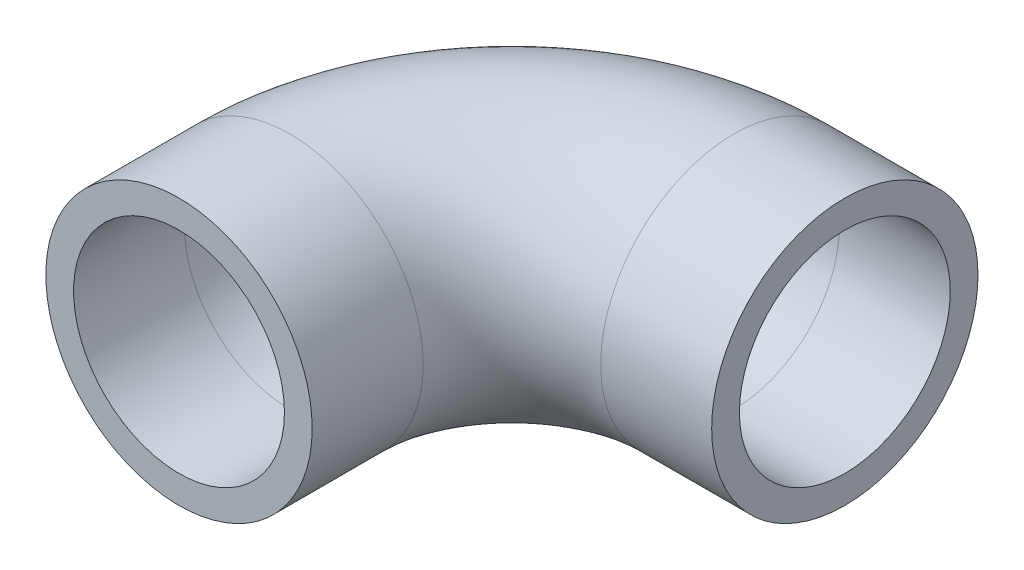
ISO-10303-21;
HEADER;
FILE_DESCRIPTION(('STEP AP214'),'2;1');
FILE_NAME('part.step','',(''),(''),'','','');
FILE_SCHEMA(('AUTOMOTIVE_DESIGN { 1 0 10303 214 1 1 1 1 }'));
ENDSEC;
DATA;
#1=APPLICATION_CONTEXT('core data for automotive mechanical design processes');
#2=APPLICATION_PROTOCOL_DEFINITION('international standard','automotive_design',2000,#1);
#3=PRODUCT_CONTEXT('',#1,'mechanical');
#4=PRODUCT('Part','Part','',(#3));
#5=PRODUCT_RELATED_PRODUCT_CATEGORY('part','',(#4));
#6=PRODUCT_DEFINITION_FORMATION('','',#4);
#7=PRODUCT_DEFINITION_CONTEXT('part definition',#1,'design');
#8=PRODUCT_DEFINITION('design','',#6,#7);
#9=PRODUCT_DEFINITION_SHAPE('','',#8);
#10=(LENGTH_UNIT() NAMED_UNIT(*) SI_UNIT(.MILLI.,.METRE.));
#11=(NAMED_UNIT(*) PLANE_ANGLE_UNIT() SI_UNIT($,.RADIAN.));
#12=(NAMED_UNIT(*) SI_UNIT($,.STERADIAN.) SOLID_ANGLE_UNIT());
#13=UNCERTAINTY_MEASURE_WITH_UNIT(LENGTH_MEASURE(1.E-05),#10,'distance_accuracy_value','');
#14=(GEOMETRIC_REPRESENTATION_CONTEXT(3) GLOBAL_UNCERTAINTY_ASSIGNED_CONTEXT((#13)) GLOBAL_UNIT_ASSIGNED_CONTEXT((#10,
#11,#12)) REPRESENTATION_CONTEXT('',''));
#15=CARTESIAN_POINT('',(0.,0.,0.));
#16=DIRECTION('',(0.,0.,1.));
#17=DIRECTION('',(1.,0.,0.));
#18=AXIS2_PLACEMENT_3D('',#15,#16,#17);
#19=CARTESIAN_POINT('',(50.8000000000002,0.,-76.1999999999998));
#20=DIRECTION('',(1.,0.,0.));
#21=DIRECTION('',(0.,0.,-1.));
#22=AXIS2_PLACEMENT_3D('',#19,#20,#21);
#23=CYLINDRICAL_SURFACE('',#22,30.48);
#24=CARTESIAN_POINT('',(50.8000000000002,0.,-76.1999999999998));
#25=DIRECTION('',(-1.,0.,0.));
#26=DIRECTION('',(0.,0.,1.));
#27=AXIS2_PLACEMENT_3D('',#24,#25,#26);
#28=CIRCLE('',#27,30.48);
#29=CARTESIAN_POINT('',(50.8000000000003,0.,-106.68));
#30=VERTEX_POINT('',#29);
#31=EDGE_CURVE('E47',#30,#30,#28,.T.);
#32=ORIENTED_EDGE('',*,*,#31,.F.);
#33=EDGE_LOOP('',(#32));
#34=FACE_BOUND('',#33,.T.);
#35=CARTESIAN_POINT('',(76.2,0.,-76.1999999999997));
#36=DIRECTION('',(-1.,0.,0.));
#37=DIRECTION('',(0.,0.,1.));
#38=AXIS2_PLACEMENT_3D('',#35,#36,#37);
#39=CIRCLE('',#38,30.48);
#40=CARTESIAN_POINT('',(76.1999999999999,0.,-45.7199999999997));
#41=VERTEX_POINT('',#40);
#42=EDGE_CURVE('E10',#41,#41,#39,.T.);
#43=ORIENTED_EDGE('',*,*,#42,.T.);
#44=EDGE_LOOP('',(#43));
#45=FACE_BOUND('',#44,.T.);
#46=ADVANCED_FACE('F35',(#34,#45),#23,.T.);
#47=CARTESIAN_POINT('',(50.8000000000002,0.,-76.1999999999998));
#48=DIRECTION('',(1.,0.,0.));
#49=DIRECTION('',(0.,0.,-1.));
#50=AXIS2_PLACEMENT_3D('',#47,#48,#49);
#51=CYLINDRICAL_SURFACE('',#50,24.13);
#52=CARTESIAN_POINT('',(50.8000000000002,0.,-76.1999999999998));
#53=DIRECTION('',(-1.,0.,0.));
#54=DIRECTION('',(0.,0.,1.));
#55=AXIS2_PLACEMENT_3D('',#52,#53,#54);
#56=CIRCLE('',#55,24.13);
#57=CARTESIAN_POINT('',(50.8000000000003,0.,-100.33));
#58=VERTEX_POINT('',#57);
#59=EDGE_CURVE('E53',#58,#58,#56,.T.);
#60=ORIENTED_EDGE('',*,*,#59,.T.);
#61=EDGE_LOOP('',(#60));
#62=FACE_BOUND('',#61,.T.);
#63=CARTESIAN_POINT('',(76.2,0.,-76.1999999999997));
#64=DIRECTION('',(-1.,0.,0.));
#65=DIRECTION('',(0.,0.,1.));
#66=AXIS2_PLACEMENT_3D('',#63,#64,#65);
#67=CIRCLE('',#66,24.13);
#68=CARTESIAN_POINT('',(76.1999999999999,0.,-52.0699999999997));
#69=VERTEX_POINT('',#68);
#70=EDGE_CURVE('E42',#69,#69,#67,.T.);
#71=ORIENTED_EDGE('',*,*,#70,.F.);
#72=EDGE_LOOP('',(#71));
#73=FACE_BOUND('',#72,.T.);
#74=ADVANCED_FACE('F100',(#62,#73),#51,.F.);
#75=CARTESIAN_POINT('',(50.8,0.,-25.3999999999998));
#76=DIRECTION('',(0.,-1.,0.));
#77=DIRECTION('',(0.,0.,-1.));
#78=AXIS2_PLACEMENT_3D('',#75,#76,#77);
#79=TOROIDAL_SURFACE('',#78,50.8,30.48);
#80=CARTESIAN_POINT('',(0.,0.,-25.3999999999998));
#81=DIRECTION('',(0.,0.,1.));
#82=DIRECTION('',(1.,0.,0.));
#83=AXIS2_PLACEMENT_3D('',#80,#81,#82);
#84=CIRCLE('',#83,30.48);
#85=CARTESIAN_POINT('',(-30.48,0.,-25.3999999999998));
#86=VERTEX_POINT('',#85);
#87=EDGE_CURVE('E58',#86,#86,#84,.T.);
#88=CARTESIAN_POINT('',(50.8,0.,-25.3999999999998));
#89=DIRECTION('',(0.,-1.,0.));
#90=DIRECTION('',(0.,0.,-1.));
#91=AXIS2_PLACEMENT_3D('',#88,#89,#90);
#92=CIRCLE('',#91,81.28);
#93=EDGE_CURVE('',#86,#30,#92,.T.);
#94=ORIENTED_EDGE('',*,*,#87,.F.);
#95=ORIENTED_EDGE('',*,*,#31,.T.);
#96=ORIENTED_EDGE('',*,*,#93,.T.);
#97=ORIENTED_EDGE('',*,*,#93,.F.);
#98=EDGE_LOOP('',(#94,#96,#95,#97));
#99=FACE_BOUND('',#98,.T.);
#100=ADVANCED_FACE('F105',(#99),#79,.T.);
#101=CARTESIAN_POINT('',(50.8,0.,-25.3999999999998));
#102=DIRECTION('',(0.,-1.,0.));
#103=DIRECTION('',(0.,0.,-1.));
#104=AXIS2_PLACEMENT_3D('',#101,#102,#103);
#105=TOROIDAL_SURFACE('',#104,50.8,24.13);
#106=CARTESIAN_POINT('',(0.,0.,-25.3999999999998));
#107=DIRECTION('',(0.,0.,1.));
#108=DIRECTION('',(1.,0.,0.));
#109=AXIS2_PLACEMENT_3D('',#106,#107,#108);
#110=CIRCLE('',#109,24.13);
#111=CARTESIAN_POINT('',(-24.13,0.,-25.3999999999998));
#112=VERTEX_POINT('',#111);
#113=EDGE_CURVE('E63',#112,#112,#110,.T.);
#114=CARTESIAN_POINT('',(50.8,0.,-25.3999999999998));
#115=DIRECTION('',(0.,-1.,0.));
#116=DIRECTION('',(0.,0.,-1.));
#117=AXIS2_PLACEMENT_3D('',#114,#115,#116);
#118=CIRCLE('',#117,74.93);
#119=EDGE_CURVE('',#112,#58,#118,.T.);
#120=ORIENTED_EDGE('',*,*,#113,.T.);
#121=ORIENTED_EDGE('',*,*,#59,.F.);
#122=ORIENTED_EDGE('',*,*,#119,.T.);
#123=ORIENTED_EDGE('',*,*,#119,.F.);
#124=EDGE_LOOP('',(#120,#122,#121,#123));
#125=FACE_BOUND('',#124,.T.);
#126=ADVANCED_FACE('F75',(#125),#105,.F.);
#127=CARTESIAN_POINT('',(0.,0.,-25.3999999999998));
#128=DIRECTION('',(0.,0.,1.));
#129=DIRECTION('',(1.,0.,0.));
#130=AXIS2_PLACEMENT_3D('',#127,#128,#129);
#131=CYLINDRICAL_SURFACE('',#130,24.13);
#132=ORIENTED_EDGE('',*,*,#113,.F.);
#133=EDGE_LOOP('',(#132));
#134=FACE_BOUND('',#133,.T.);
#135=CARTESIAN_POINT('',(0.,0.,0.));
#136=DIRECTION('',(0.,0.,1.));
#137=DIRECTION('',(1.,0.,0.));
#138=AXIS2_PLACEMENT_3D('',#135,#136,#137);
#139=CIRCLE('',#138,24.13);
#140=CARTESIAN_POINT('',(24.13,0.,0.));
#141=VERTEX_POINT('',#140);
#142=EDGE_CURVE('E64',#141,#141,#139,.T.);
#143=ORIENTED_EDGE('',*,*,#142,.T.);
#144=EDGE_LOOP('',(#143));
#145=FACE_BOUND('',#144,.T.);
#146=ADVANCED_FACE('F78',(#134,#145),#131,.F.);
#147=CARTESIAN_POINT('',(0.,0.,-25.3999999999998));
#148=DIRECTION('',(0.,0.,1.));
#149=DIRECTION('',(1.,0.,0.));
#150=AXIS2_PLACEMENT_3D('',#147,#148,#149);
#151=CYLINDRICAL_SURFACE('',#150,30.48);
#152=ORIENTED_EDGE('',*,*,#87,.T.);
#153=EDGE_LOOP('',(#152));
#154=FACE_BOUND('',#153,.T.);
#155=CARTESIAN_POINT('',(0.,0.,0.));
#156=DIRECTION('',(0.,0.,1.));
#157=DIRECTION('',(1.,0.,0.));
#158=AXIS2_PLACEMENT_3D('',#155,#156,#157);
#159=CIRCLE('',#158,30.48);
#160=CARTESIAN_POINT('',(30.48,0.,0.));
#161=VERTEX_POINT('',#160);
#162=EDGE_CURVE('E59',#161,#161,#159,.T.);
#163=ORIENTED_EDGE('',*,*,#162,.F.);
#164=EDGE_LOOP('',(#163));
#165=FACE_BOUND('',#164,.T.);
#166=ADVANCED_FACE('F81',(#154,#165),#151,.T.);
#167=CARTESIAN_POINT('',(76.2,0.,-76.1999999999997));
#168=DIRECTION('',(-1.,0.,0.));
#169=DIRECTION('',(0.,0.,1.));
#170=AXIS2_PLACEMENT_3D('',#167,#168,#169);
#171=PLANE('',#170);
#172=ORIENTED_EDGE('',*,*,#70,.T.);
#173=EDGE_LOOP('',(#172));
#174=FACE_BOUND('',#173,.T.);
#175=ORIENTED_EDGE('',*,*,#42,.F.);
#176=EDGE_LOOP('',(#175));
#177=FACE_BOUND('',#176,.T.);
#178=ADVANCED_FACE('F88',(#174,#177),#171,.F.);
#179=CARTESIAN_POINT('',(0.,0.,0.));
#180=DIRECTION('',(0.,0.,1.));
#181=DIRECTION('',(1.,0.,0.));
#182=AXIS2_PLACEMENT_3D('',#179,#180,#181);
#183=PLANE('',#182);
#184=ORIENTED_EDGE('',*,*,#142,.F.);
#185=EDGE_LOOP('',(#184));
#186=FACE_BOUND('',#185,.T.);
#187=ORIENTED_EDGE('',*,*,#162,.T.);
#188=EDGE_LOOP('',(#187));
#189=FACE_BOUND('',#188,.T.);
#190=ADVANCED_FACE('F85',(#186,#189),#183,.T.);
#191=CLOSED_SHELL('',(#46,#74,#100,#126,#146,#166,#178,#190));
#192=MANIFOLD_SOLID_BREP('B2',#191);
#193=ADVANCED_BREP_SHAPE_REPRESENTATION('',(#18,#192),#14);
#194=SHAPE_DEFINITION_REPRESENTATION(#9,#193);
ENDSEC;
END-ISO-10303-21;
